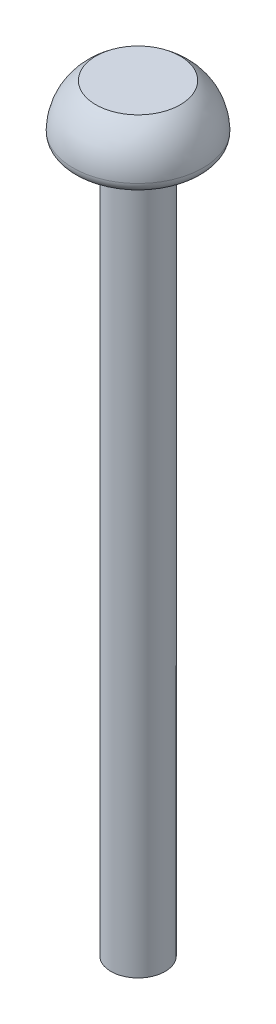
ISO-10303-21;
HEADER;
FILE_DESCRIPTION(('STEP AP214'),'2;1');
FILE_NAME('part.step','',(''),(''),'','','');
FILE_SCHEMA(('AUTOMOTIVE_DESIGN { 1 0 10303 214 1 1 1 1 }'));
ENDSEC;
DATA;
#1=APPLICATION_CONTEXT('core data for automotive mechanical design processes');
#2=APPLICATION_PROTOCOL_DEFINITION('international standard','automotive_design',2000,#1);
#3=PRODUCT_CONTEXT('',#1,'mechanical');
#4=PRODUCT('Part','Part','',(#3));
#5=PRODUCT_RELATED_PRODUCT_CATEGORY('part','',(#4));
#6=PRODUCT_DEFINITION_FORMATION('','',#4);
#7=PRODUCT_DEFINITION_CONTEXT('part definition',#1,'design');
#8=PRODUCT_DEFINITION('design','',#6,#7);
#9=PRODUCT_DEFINITION_SHAPE('','',#8);
#10=(LENGTH_UNIT() NAMED_UNIT(*) SI_UNIT(.MILLI.,.METRE.));
#11=(NAMED_UNIT(*) PLANE_ANGLE_UNIT() SI_UNIT($,.RADIAN.));
#12=(NAMED_UNIT(*) SI_UNIT($,.STERADIAN.) SOLID_ANGLE_UNIT());
#13=UNCERTAINTY_MEASURE_WITH_UNIT(LENGTH_MEASURE(1.E-05),#10,'distance_accuracy_value','');
#14=(GEOMETRIC_REPRESENTATION_CONTEXT(3) GLOBAL_UNCERTAINTY_ASSIGNED_CONTEXT((#13)) GLOBAL_UNIT_ASSIGNED_CONTEXT((#10,
#11,#12)) REPRESENTATION_CONTEXT('',''));
#15=CARTESIAN_POINT('',(0.,0.,0.));
#16=DIRECTION('',(0.,0.,1.));
#17=DIRECTION('',(1.,0.,0.));
#18=AXIS2_PLACEMENT_3D('',#15,#16,#17);
#19=CARTESIAN_POINT('',(0.,83.602856598858,0.));
#20=DIRECTION('',(0.,-1.,0.));
#21=DIRECTION('',(0.,0.,-1.));
#22=AXIS2_PLACEMENT_3D('',#19,#20,#21);
#23=PLANE('',#22);
#24=CARTESIAN_POINT('',(0.,83.602856598858,0.));
#25=DIRECTION('',(0.,-1.,0.));
#26=DIRECTION('',(0.,0.,-1.));
#27=AXIS2_PLACEMENT_3D('',#24,#25,#26);
#28=CIRCLE('',#27,8.00000000000007);
#29=CARTESIAN_POINT('',(0.,83.602856598858,-8.00000000000007));
#30=VERTEX_POINT('',#29);
#31=EDGE_CURVE('E10',#30,#30,#28,.T.);
#32=ORIENTED_EDGE('',*,*,#31,.T.);
#33=EDGE_LOOP('',(#32));
#34=FACE_BOUND('',#33,.T.);
#35=ADVANCED_FACE('F39',(#34),#23,.T.);
#36=CARTESIAN_POINT('',(0.,-51.4788622793515,0.));
#37=DIRECTION('',(0.,-1.,0.));
#38=DIRECTION('',(0.,0.,-1.));
#39=AXIS2_PLACEMENT_3D('',#36,#37,#38);
#40=CYLINDRICAL_SURFACE('',#39,8.00000000000007);
#41=ORIENTED_EDGE('',*,*,#31,.F.);
#42=EDGE_LOOP('',(#41));
#43=FACE_BOUND('',#42,.T.);
#44=CARTESIAN_POINT('',(0.,33.602856598858,0.));
#45=DIRECTION('',(0.,-1.,0.));
#46=DIRECTION('',(0.,0.,-1.));
#47=AXIS2_PLACEMENT_3D('',#44,#45,#46);
#48=CIRCLE('',#47,8.00000000000007);
#49=CARTESIAN_POINT('',(0.,33.602856598858,-8.00000000000007));
#50=VERTEX_POINT('',#49);
#51=EDGE_CURVE('E46',#50,#50,#48,.T.);
#52=ORIENTED_EDGE('',*,*,#51,.T.);
#53=EDGE_LOOP('',(#52));
#54=FACE_BOUND('',#53,.T.);
#55=ADVANCED_FACE('F87',(#43,#54),#40,.F.);
#56=CARTESIAN_POINT('',(0.,33.602856598858,0.));
#57=DIRECTION('',(0.,-1.,0.));
#58=DIRECTION('',(0.,0.,-1.));
#59=AXIS2_PLACEMENT_3D('',#56,#57,#58);
#60=PLANE('',#59);
#61=CARTESIAN_POINT('',(0.,33.602856598858,0.));
#62=DIRECTION('',(0.,-1.,0.));
#63=DIRECTION('',(0.,0.,-1.));
#64=AXIS2_PLACEMENT_3D('',#61,#62,#63);
#65=CIRCLE('',#64,25.);
#66=CARTESIAN_POINT('',(0.,33.602856598858,-25.));
#67=VERTEX_POINT('',#66);
#68=EDGE_CURVE('E51',#67,#67,#65,.T.);
#69=ORIENTED_EDGE('',*,*,#68,.T.);
#70=EDGE_LOOP('',(#69));
#71=FACE_BOUND('',#70,.T.);
#72=ORIENTED_EDGE('',*,*,#51,.F.);
#73=EDGE_LOOP('',(#72));
#74=FACE_BOUND('',#73,.T.);
#75=ADVANCED_FACE('F91',(#71,#74),#60,.T.);
#76=CARTESIAN_POINT('',(0.,-51.4788622793515,0.));
#77=DIRECTION('',(0.,-1.,0.));
#78=DIRECTION('',(0.,0.,-1.));
#79=AXIS2_PLACEMENT_3D('',#76,#77,#78);
#80=CYLINDRICAL_SURFACE('',#79,25.);
#81=CARTESIAN_POINT('',(0.,683.602856598858,0.));
#82=DIRECTION('',(0.,-1.,0.));
#83=DIRECTION('',(0.,0.,-1.));
#84=AXIS2_PLACEMENT_3D('',#81,#82,#83);
#85=CIRCLE('',#84,25.);
#86=CARTESIAN_POINT('',(0.,683.602856598858,-25.));
#87=VERTEX_POINT('',#86);
#88=EDGE_CURVE('E56',#87,#87,#85,.T.);
#89=ORIENTED_EDGE('',*,*,#88,.T.);
#90=EDGE_LOOP('',(#89));
#91=FACE_BOUND('',#90,.T.);
#92=ORIENTED_EDGE('',*,*,#68,.F.);
#93=EDGE_LOOP('',(#92));
#94=FACE_BOUND('',#93,.T.);
#95=ADVANCED_FACE('F96',(#91,#94),#80,.T.);
#96=CARTESIAN_POINT('',(0.,683.602856598858,0.));
#97=DIRECTION('',(0.,-1.,0.));
#98=DIRECTION('',(0.,0.,-1.));
#99=AXIS2_PLACEMENT_3D('',#96,#97,#98);
#100=PLANE('',#99);
#101=CARTESIAN_POINT('',(0.,683.602856598858,0.));
#102=DIRECTION('',(0.,-1.,0.));
#103=DIRECTION('',(0.,0.,-1.));
#104=AXIS2_PLACEMENT_3D('',#101,#102,#103);
#105=CIRCLE('',#104,50.);
#106=CARTESIAN_POINT('',(0.,683.602856598858,-50.));
#107=VERTEX_POINT('',#106);
#108=EDGE_CURVE('E62',#107,#107,#105,.T.);
#109=ORIENTED_EDGE('',*,*,#108,.T.);
#110=EDGE_LOOP('',(#109));
#111=FACE_BOUND('',#110,.T.);
#112=ORIENTED_EDGE('',*,*,#88,.F.);
#113=EDGE_LOOP('',(#112));
#114=FACE_BOUND('',#113,.T.);
#115=ADVANCED_FACE('F102',(#111,#114),#100,.T.);
#116=CARTESIAN_POINT('',(0.,693.602856598858,0.));
#117=DIRECTION('',(0.,-1.,0.));
#118=DIRECTION('',(0.,0.,-1.));
#119=AXIS2_PLACEMENT_3D('',#116,#117,#118);
#120=TOROIDAL_SURFACE('',#119,50.,10.);
#121=CARTESIAN_POINT('',(0.,693.602856598858,0.));
#122=DIRECTION('',(0.,-1.,0.));
#123=DIRECTION('',(0.,0.,-1.));
#124=AXIS2_PLACEMENT_3D('',#121,#122,#123);
#125=CIRCLE('',#124,60.);
#126=CARTESIAN_POINT('',(0.,693.602856598858,-60.));
#127=VERTEX_POINT('',#126);
#128=EDGE_CURVE('E66',#127,#127,#125,.T.);
#129=ORIENTED_EDGE('',*,*,#128,.T.);
#130=EDGE_LOOP('',(#129));
#131=FACE_BOUND('',#130,.T.);
#132=ORIENTED_EDGE('',*,*,#108,.F.);
#133=EDGE_LOOP('',(#132));
#134=FACE_BOUND('',#133,.T.);
#135=ADVANCED_FACE('F84',(#131,#134),#120,.T.);
#136=CARTESIAN_POINT('',(0.,692.843431999939,0.));
#137=DIRECTION('',(0.,-1.,0.));
#138=DIRECTION('',(0.,0.,-1.));
#139=AXIS2_PLACEMENT_3D('',#136,#137,#138);
#140=DEGENERATE_TOROIDAL_SURFACE('',#139,10.0057675898653,50.,.T.);
#141=CARTESIAN_POINT('',(0.,733.602856598858,0.));
#142=DIRECTION('',(0.,-1.,0.));
#143=DIRECTION('',(0.,0.,-1.));
#144=AXIS2_PLACEMENT_3D('',#141,#142,#143);
#145=CIRCLE('',#144,38.9655553371021);
#146=CARTESIAN_POINT('',(0.,733.602856598858,-38.9655553371021));
#147=VERTEX_POINT('',#146);
#148=EDGE_CURVE('E70',#147,#147,#145,.T.);
#149=ORIENTED_EDGE('',*,*,#148,.T.);
#150=EDGE_LOOP('',(#149));
#151=FACE_BOUND('',#150,.T.);
#152=ORIENTED_EDGE('',*,*,#128,.F.);
#153=EDGE_LOOP('',(#152));
#154=FACE_BOUND('',#153,.T.);
#155=ADVANCED_FACE('F75',(#151,#154),#140,.T.);
#156=CARTESIAN_POINT('',(0.,733.602856598858,0.));
#157=DIRECTION('',(0.,-1.,0.));
#158=DIRECTION('',(0.,0.,-1.));
#159=AXIS2_PLACEMENT_3D('',#156,#157,#158);
#160=PLANE('',#159);
#161=ORIENTED_EDGE('',*,*,#148,.F.);
#162=EDGE_LOOP('',(#161));
#163=FACE_BOUND('',#162,.T.);
#164=ADVANCED_FACE('F78',(#163),#160,.F.);
#165=CLOSED_SHELL('',(#35,#55,#75,#95,#115,#135,#155,#164));
#166=MANIFOLD_SOLID_BREP('B2',#165);
#167=ADVANCED_BREP_SHAPE_REPRESENTATION('',(#18,#166),#14);
#168=SHAPE_DEFINITION_REPRESENTATION(#9,#167);
ENDSEC;
END-ISO-10303-21;
